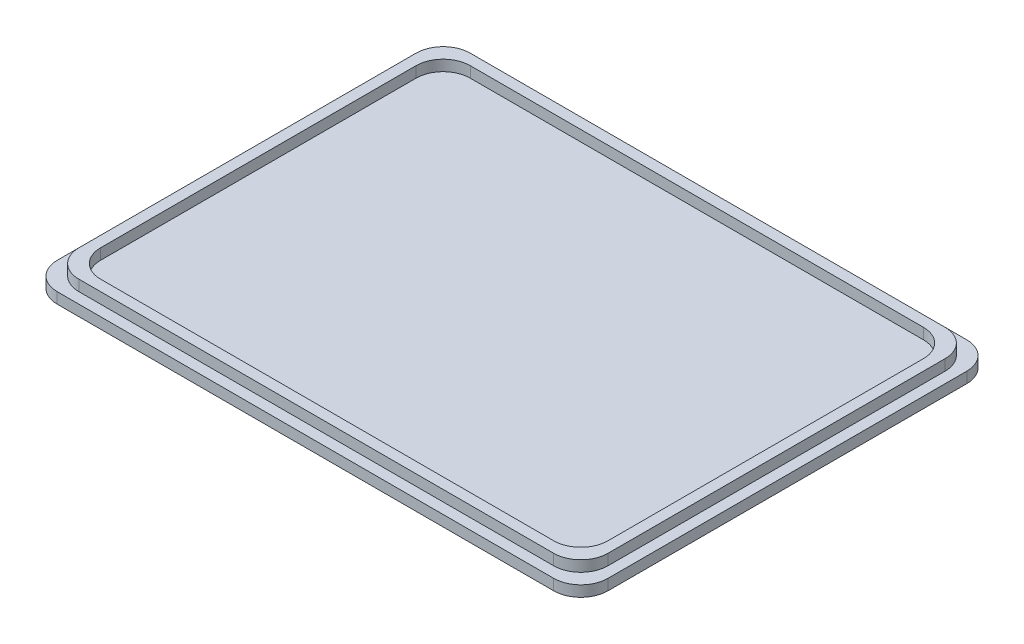
ISO-10303-21;
HEADER;
FILE_DESCRIPTION(('STEP AP214'),'2;1');
FILE_NAME('part.step','',(''),(''),'','','');
FILE_SCHEMA(('AUTOMOTIVE_DESIGN { 1 0 10303 214 1 1 1 1 }'));
ENDSEC;
DATA;
#1=APPLICATION_CONTEXT('core data for automotive mechanical design processes');
#2=APPLICATION_PROTOCOL_DEFINITION('international standard','automotive_design',2000,#1);
#3=PRODUCT_CONTEXT('',#1,'mechanical');
#4=PRODUCT('Part','Part','',(#3));
#5=PRODUCT_RELATED_PRODUCT_CATEGORY('part','',(#4));
#6=PRODUCT_DEFINITION_FORMATION('','',#4);
#7=PRODUCT_DEFINITION_CONTEXT('part definition',#1,'design');
#8=PRODUCT_DEFINITION('design','',#6,#7);
#9=PRODUCT_DEFINITION_SHAPE('','',#8);
#10=(LENGTH_UNIT() NAMED_UNIT(*) SI_UNIT(.MILLI.,.METRE.));
#11=(NAMED_UNIT(*) PLANE_ANGLE_UNIT() SI_UNIT($,.RADIAN.));
#12=(NAMED_UNIT(*) SI_UNIT($,.STERADIAN.) SOLID_ANGLE_UNIT());
#13=UNCERTAINTY_MEASURE_WITH_UNIT(LENGTH_MEASURE(1.E-05),#10,'distance_accuracy_value','');
#14=(GEOMETRIC_REPRESENTATION_CONTEXT(3) GLOBAL_UNCERTAINTY_ASSIGNED_CONTEXT((#13)) GLOBAL_UNIT_ASSIGNED_CONTEXT((#10,
#11,#12)) REPRESENTATION_CONTEXT('',''));
#15=CARTESIAN_POINT('',(0.,0.,0.));
#16=DIRECTION('',(0.,0.,1.));
#17=DIRECTION('',(1.,0.,0.));
#18=AXIS2_PLACEMENT_3D('',#15,#16,#17);
#19=CARTESIAN_POINT('',(0.,2.,0.));
#20=DIRECTION('',(0.,-1.,0.));
#21=DIRECTION('',(0.,0.,-1.));
#22=AXIS2_PLACEMENT_3D('',#19,#20,#21);
#23=PLANE('',#22);
#24=DIRECTION('',(-1.,0.,0.));
#25=VECTOR('',#24,1.);
#26=CARTESIAN_POINT('',(-50.8,2.,-38.1));
#27=LINE('',#26,#25);
#28=CARTESIAN_POINT('',(45.8,2.,-38.1));
#29=VERTEX_POINT('',#28);
#30=CARTESIAN_POINT('',(-45.8,2.,-38.1));
#31=VERTEX_POINT('',#30);
#32=EDGE_CURVE('E389',#29,#31,#27,.T.);
#33=ORIENTED_EDGE('',*,*,#32,.T.);
#34=CARTESIAN_POINT('',(-45.8,2.,-33.1));
#35=DIRECTION('',(0.,-1.,0.));
#36=DIRECTION('',(0.,0.,-1.));
#37=AXIS2_PLACEMENT_3D('',#34,#35,#36);
#38=CIRCLE('',#37,5.);
#39=CARTESIAN_POINT('',(-50.8,2.,-33.1));
#40=VERTEX_POINT('',#39);
#41=EDGE_CURVE('E267',#31,#40,#38,.F.);
#42=ORIENTED_EDGE('',*,*,#41,.T.);
#43=DIRECTION('',(0.,0.,1.));
#44=VECTOR('',#43,1.);
#45=CARTESIAN_POINT('',(-50.8,2.,38.1));
#46=LINE('',#45,#44);
#47=CARTESIAN_POINT('',(-50.8,2.,33.1));
#48=VERTEX_POINT('',#47);
#49=EDGE_CURVE('E236',#40,#48,#46,.T.);
#50=ORIENTED_EDGE('',*,*,#49,.T.);
#51=CARTESIAN_POINT('',(-45.8,2.,33.1));
#52=DIRECTION('',(0.,-1.,0.));
#53=DIRECTION('',(0.,0.,-1.));
#54=AXIS2_PLACEMENT_3D('',#51,#52,#53);
#55=CIRCLE('',#54,5.);
#56=CARTESIAN_POINT('',(-45.8,2.,38.1));
#57=VERTEX_POINT('',#56);
#58=EDGE_CURVE('E265',#48,#57,#55,.F.);
#59=ORIENTED_EDGE('',*,*,#58,.T.);
#60=DIRECTION('',(1.,0.,0.));
#61=VECTOR('',#60,1.);
#62=CARTESIAN_POINT('',(-50.8,2.,38.1));
#63=LINE('',#62,#61);
#64=CARTESIAN_POINT('',(45.8,2.,38.1));
#65=VERTEX_POINT('',#64);
#66=EDGE_CURVE('E252',#57,#65,#63,.T.);
#67=ORIENTED_EDGE('',*,*,#66,.T.);
#68=CARTESIAN_POINT('',(45.8,2.,33.1));
#69=DIRECTION('',(0.,-1.,0.));
#70=DIRECTION('',(0.,0.,-1.));
#71=AXIS2_PLACEMENT_3D('',#68,#69,#70);
#72=CIRCLE('',#71,5.);
#73=CARTESIAN_POINT('',(50.8,2.,33.1));
#74=VERTEX_POINT('',#73);
#75=EDGE_CURVE('E261',#65,#74,#72,.F.);
#76=ORIENTED_EDGE('',*,*,#75,.T.);
#77=DIRECTION('',(0.,0.,-1.));
#78=VECTOR('',#77,1.);
#79=CARTESIAN_POINT('',(50.8,2.,38.1));
#80=LINE('',#79,#78);
#81=CARTESIAN_POINT('',(50.8,2.,-33.1));
#82=VERTEX_POINT('',#81);
#83=EDGE_CURVE('E246',#74,#82,#80,.T.);
#84=ORIENTED_EDGE('',*,*,#83,.T.);
#85=CARTESIAN_POINT('',(45.8,2.,-33.1));
#86=DIRECTION('',(0.,-1.,0.));
#87=DIRECTION('',(0.,0.,-1.));
#88=AXIS2_PLACEMENT_3D('',#85,#86,#87);
#89=CIRCLE('',#88,5.);
#90=EDGE_CURVE('E263',#82,#29,#89,.F.);
#91=ORIENTED_EDGE('',*,*,#90,.T.);
#92=EDGE_LOOP('',(#33,#42,#50,#59,#67,#76,#84,#91));
#93=FACE_BOUND('',#92,.T.);
#94=DIRECTION('',(-1.,0.,0.));
#95=VECTOR('',#94,1.);
#96=CARTESIAN_POINT('',(48.8,2.,-36.1));
#97=LINE('',#96,#95);
#98=CARTESIAN_POINT('',(43.8,2.,-36.1));
#99=VERTEX_POINT('',#98);
#100=CARTESIAN_POINT('',(-43.8,2.,-36.1));
#101=VERTEX_POINT('',#100);
#102=EDGE_CURVE('E380',#99,#101,#97,.T.);
#103=ORIENTED_EDGE('',*,*,#102,.F.);
#104=CARTESIAN_POINT('',(43.8,2.,-31.1));
#105=DIRECTION('',(0.,-1.,0.));
#106=DIRECTION('',(0.,0.,-1.));
#107=AXIS2_PLACEMENT_3D('',#104,#105,#106);
#108=CIRCLE('',#107,5.);
#109=CARTESIAN_POINT('',(48.8,2.,-31.1));
#110=VERTEX_POINT('',#109);
#111=EDGE_CURVE('E342',#99,#110,#108,.T.);
#112=ORIENTED_EDGE('',*,*,#111,.T.);
#113=DIRECTION('',(0.,0.,-1.));
#114=VECTOR('',#113,1.);
#115=CARTESIAN_POINT('',(48.8,2.,36.1));
#116=LINE('',#115,#114);
#117=CARTESIAN_POINT('',(48.8,2.,31.1));
#118=VERTEX_POINT('',#117);
#119=EDGE_CURVE('E350',#118,#110,#116,.T.);
#120=ORIENTED_EDGE('',*,*,#119,.F.);
#121=CARTESIAN_POINT('',(43.8,2.,31.1));
#122=DIRECTION('',(0.,-1.,0.));
#123=DIRECTION('',(0.,0.,-1.));
#124=AXIS2_PLACEMENT_3D('',#121,#122,#123);
#125=CIRCLE('',#124,5.);
#126=CARTESIAN_POINT('',(43.8,2.,36.1));
#127=VERTEX_POINT('',#126);
#128=EDGE_CURVE('E344',#118,#127,#125,.T.);
#129=ORIENTED_EDGE('',*,*,#128,.T.);
#130=DIRECTION('',(1.,0.,0.));
#131=VECTOR('',#130,1.);
#132=CARTESIAN_POINT('',(-48.8,2.,36.1));
#133=LINE('',#132,#131);
#134=CARTESIAN_POINT('',(-43.8,2.,36.1));
#135=VERTEX_POINT('',#134);
#136=EDGE_CURVE('E348',#135,#127,#133,.T.);
#137=ORIENTED_EDGE('',*,*,#136,.F.);
#138=CARTESIAN_POINT('',(-43.8,2.,31.1));
#139=DIRECTION('',(0.,-1.,0.));
#140=DIRECTION('',(0.,0.,-1.));
#141=AXIS2_PLACEMENT_3D('',#138,#139,#140);
#142=CIRCLE('',#141,5.);
#143=CARTESIAN_POINT('',(-48.8,2.,31.1));
#144=VERTEX_POINT('',#143);
#145=EDGE_CURVE('E64',#135,#144,#142,.T.);
#146=ORIENTED_EDGE('',*,*,#145,.T.);
#147=DIRECTION('',(0.,0.,1.));
#148=VECTOR('',#147,1.);
#149=CARTESIAN_POINT('',(-48.8,2.,-36.1));
#150=LINE('',#149,#148);
#151=CARTESIAN_POINT('',(-48.8,2.,-31.1));
#152=VERTEX_POINT('',#151);
#153=EDGE_CURVE('E359',#152,#144,#150,.T.);
#154=ORIENTED_EDGE('',*,*,#153,.F.);
#155=CARTESIAN_POINT('',(-43.8,2.,-31.1));
#156=DIRECTION('',(0.,-1.,0.));
#157=DIRECTION('',(0.,0.,-1.));
#158=AXIS2_PLACEMENT_3D('',#155,#156,#157);
#159=CIRCLE('',#158,5.);
#160=EDGE_CURVE('E12',#152,#101,#159,.T.);
#161=ORIENTED_EDGE('',*,*,#160,.T.);
#162=EDGE_LOOP('',(#103,#112,#120,#129,#137,#146,#154,#161));
#163=FACE_BOUND('',#162,.T.);
#164=ADVANCED_FACE('F56',(#93,#163),#23,.F.);
#165=CARTESIAN_POINT('',(50.8,2.,38.1));
#166=DIRECTION('',(-1.,0.,0.));
#167=DIRECTION('',(0.,0.,1.));
#168=AXIS2_PLACEMENT_3D('',#165,#166,#167);
#169=PLANE('',#168);
#170=DIRECTION('',(0.,0.,-1.));
#171=VECTOR('',#170,1.);
#172=CARTESIAN_POINT('',(50.8,0.,38.1));
#173=LINE('',#172,#171);
#174=CARTESIAN_POINT('',(50.8,0.,33.1));
#175=VERTEX_POINT('',#174);
#176=CARTESIAN_POINT('',(50.8,0.,-33.1));
#177=VERTEX_POINT('',#176);
#178=EDGE_CURVE('E248',#175,#177,#173,.T.);
#179=ORIENTED_EDGE('',*,*,#178,.T.);
#180=DIRECTION('',(0.,-1.,0.));
#181=VECTOR('',#180,1.);
#182=CARTESIAN_POINT('',(50.8,2.,-33.1));
#183=LINE('',#182,#181);
#184=EDGE_CURVE('E277',#177,#82,#183,.F.);
#185=ORIENTED_EDGE('',*,*,#184,.T.);
#186=ORIENTED_EDGE('',*,*,#83,.F.);
#187=DIRECTION('',(0.,-1.,0.));
#188=VECTOR('',#187,1.);
#189=CARTESIAN_POINT('',(50.8,2.,33.1));
#190=LINE('',#189,#188);
#191=EDGE_CURVE('E274',#74,#175,#190,.T.);
#192=ORIENTED_EDGE('',*,*,#191,.T.);
#193=EDGE_LOOP('',(#179,#185,#186,#192));
#194=FACE_BOUND('',#193,.T.);
#195=ADVANCED_FACE('F407',(#194),#169,.F.);
#196=CARTESIAN_POINT('',(-50.8,2.,-38.1));
#197=DIRECTION('',(0.,0.,1.));
#198=DIRECTION('',(1.,0.,0.));
#199=AXIS2_PLACEMENT_3D('',#196,#197,#198);
#200=PLANE('',#199);
#201=DIRECTION('',(-1.,0.,0.));
#202=VECTOR('',#201,1.);
#203=CARTESIAN_POINT('',(-50.8,0.,-38.1));
#204=LINE('',#203,#202);
#205=CARTESIAN_POINT('',(45.8,0.,-38.1));
#206=VERTEX_POINT('',#205);
#207=CARTESIAN_POINT('',(-45.8,0.,-38.1));
#208=VERTEX_POINT('',#207);
#209=EDGE_CURVE('E243',#206,#208,#204,.T.);
#210=ORIENTED_EDGE('',*,*,#209,.T.);
#211=DIRECTION('',(0.,-1.,0.));
#212=VECTOR('',#211,1.);
#213=CARTESIAN_POINT('',(-45.8,2.,-38.1));
#214=LINE('',#213,#212);
#215=EDGE_CURVE('E221',#208,#31,#214,.F.);
#216=ORIENTED_EDGE('',*,*,#215,.T.);
#217=ORIENTED_EDGE('',*,*,#32,.F.);
#218=DIRECTION('',(0.,-1.,0.));
#219=VECTOR('',#218,1.);
#220=CARTESIAN_POINT('',(45.8,2.,-38.1));
#221=LINE('',#220,#219);
#222=EDGE_CURVE('E226',#29,#206,#221,.T.);
#223=ORIENTED_EDGE('',*,*,#222,.T.);
#224=EDGE_LOOP('',(#210,#216,#217,#223));
#225=FACE_BOUND('',#224,.T.);
#226=ADVANCED_FACE('F415',(#225),#200,.F.);
#227=CARTESIAN_POINT('',(-50.8,2.,38.1));
#228=DIRECTION('',(1.,0.,0.));
#229=DIRECTION('',(0.,0.,-1.));
#230=AXIS2_PLACEMENT_3D('',#227,#228,#229);
#231=PLANE('',#230);
#232=ORIENTED_EDGE('',*,*,#49,.F.);
#233=DIRECTION('',(0.,-1.,0.));
#234=VECTOR('',#233,1.);
#235=CARTESIAN_POINT('',(-50.8,2.,-33.1));
#236=LINE('',#235,#234);
#237=CARTESIAN_POINT('',(-50.8,0.,-33.1));
#238=VERTEX_POINT('',#237);
#239=EDGE_CURVE('E220',#40,#238,#236,.T.);
#240=ORIENTED_EDGE('',*,*,#239,.T.);
#241=DIRECTION('',(0.,0.,1.));
#242=VECTOR('',#241,1.);
#243=CARTESIAN_POINT('',(-50.8,0.,38.1));
#244=LINE('',#243,#242);
#245=CARTESIAN_POINT('',(-50.8,0.,33.1));
#246=VERTEX_POINT('',#245);
#247=EDGE_CURVE('E233',#238,#246,#244,.T.);
#248=ORIENTED_EDGE('',*,*,#247,.T.);
#249=DIRECTION('',(0.,-1.,0.));
#250=VECTOR('',#249,1.);
#251=CARTESIAN_POINT('',(-50.8,2.,33.1));
#252=LINE('',#251,#250);
#253=EDGE_CURVE('E238',#246,#48,#252,.F.);
#254=ORIENTED_EDGE('',*,*,#253,.T.);
#255=EDGE_LOOP('',(#232,#240,#248,#254));
#256=FACE_BOUND('',#255,.T.);
#257=ADVANCED_FACE('F232',(#256),#231,.F.);
#258=CARTESIAN_POINT('',(-50.8,2.,38.1));
#259=DIRECTION('',(0.,0.,-1.));
#260=DIRECTION('',(-1.,0.,0.));
#261=AXIS2_PLACEMENT_3D('',#258,#259,#260);
#262=PLANE('',#261);
#263=ORIENTED_EDGE('',*,*,#66,.F.);
#264=DIRECTION('',(0.,-1.,0.));
#265=VECTOR('',#264,1.);
#266=CARTESIAN_POINT('',(-45.8,2.,38.1));
#267=LINE('',#266,#265);
#268=CARTESIAN_POINT('',(-45.8,0.,38.1));
#269=VERTEX_POINT('',#268);
#270=EDGE_CURVE('E271',#57,#269,#267,.T.);
#271=ORIENTED_EDGE('',*,*,#270,.T.);
#272=DIRECTION('',(1.,0.,0.));
#273=VECTOR('',#272,1.);
#274=CARTESIAN_POINT('',(-50.8,0.,38.1));
#275=LINE('',#274,#273);
#276=CARTESIAN_POINT('',(45.8,0.,38.1));
#277=VERTEX_POINT('',#276);
#278=EDGE_CURVE('E242',#269,#277,#275,.T.);
#279=ORIENTED_EDGE('',*,*,#278,.T.);
#280=DIRECTION('',(0.,-1.,0.));
#281=VECTOR('',#280,1.);
#282=CARTESIAN_POINT('',(45.8,2.,38.1));
#283=LINE('',#282,#281);
#284=EDGE_CURVE('E269',#277,#65,#283,.F.);
#285=ORIENTED_EDGE('',*,*,#284,.T.);
#286=EDGE_LOOP('',(#263,#271,#279,#285));
#287=FACE_BOUND('',#286,.T.);
#288=ADVANCED_FACE('F418',(#287),#262,.F.);
#289=CARTESIAN_POINT('',(0.,0.,0.));
#290=DIRECTION('',(0.,-1.,0.));
#291=DIRECTION('',(0.,0.,-1.));
#292=AXIS2_PLACEMENT_3D('',#289,#290,#291);
#293=PLANE('',#292);
#294=ORIENTED_EDGE('',*,*,#247,.F.);
#295=CARTESIAN_POINT('',(-45.8,0.,-33.1));
#296=DIRECTION('',(0.,-1.,0.));
#297=DIRECTION('',(0.,0.,-1.));
#298=AXIS2_PLACEMENT_3D('',#295,#296,#297);
#299=CIRCLE('',#298,5.);
#300=EDGE_CURVE('E216',#238,#208,#299,.T.);
#301=ORIENTED_EDGE('',*,*,#300,.T.);
#302=ORIENTED_EDGE('',*,*,#209,.F.);
#303=CARTESIAN_POINT('',(45.8,0.,-33.1));
#304=DIRECTION('',(0.,-1.,0.));
#305=DIRECTION('',(0.,0.,-1.));
#306=AXIS2_PLACEMENT_3D('',#303,#304,#305);
#307=CIRCLE('',#306,5.);
#308=EDGE_CURVE('E255',#206,#177,#307,.T.);
#309=ORIENTED_EDGE('',*,*,#308,.T.);
#310=ORIENTED_EDGE('',*,*,#178,.F.);
#311=CARTESIAN_POINT('',(45.8,0.,33.1));
#312=DIRECTION('',(0.,-1.,0.));
#313=DIRECTION('',(0.,0.,-1.));
#314=AXIS2_PLACEMENT_3D('',#311,#312,#313);
#315=CIRCLE('',#314,5.);
#316=EDGE_CURVE('E237',#175,#277,#315,.T.);
#317=ORIENTED_EDGE('',*,*,#316,.T.);
#318=ORIENTED_EDGE('',*,*,#278,.F.);
#319=CARTESIAN_POINT('',(-45.8,0.,33.1));
#320=DIRECTION('',(0.,-1.,0.));
#321=DIRECTION('',(0.,0.,-1.));
#322=AXIS2_PLACEMENT_3D('',#319,#320,#321);
#323=CIRCLE('',#322,5.);
#324=EDGE_CURVE('E227',#269,#246,#323,.T.);
#325=ORIENTED_EDGE('',*,*,#324,.T.);
#326=EDGE_LOOP('',(#294,#301,#302,#309,#310,#317,#318,#325));
#327=FACE_BOUND('',#326,.T.);
#328=ADVANCED_FACE('F240',(#327),#293,.T.);
#329=CARTESIAN_POINT('',(0.,4.,0.));
#330=DIRECTION('',(0.,1.,0.));
#331=DIRECTION('',(0.,0.,1.));
#332=AXIS2_PLACEMENT_3D('',#329,#330,#331);
#333=PLANE('',#332);
#334=DIRECTION('',(0.,0.,-1.));
#335=VECTOR('',#334,1.);
#336=CARTESIAN_POINT('',(48.8,4.,36.1));
#337=LINE('',#336,#335);
#338=CARTESIAN_POINT('',(48.8,4.,31.1));
#339=VERTEX_POINT('',#338);
#340=CARTESIAN_POINT('',(48.8,4.,-31.1));
#341=VERTEX_POINT('',#340);
#342=EDGE_CURVE('E368',#339,#341,#337,.T.);
#343=ORIENTED_EDGE('',*,*,#342,.T.);
#344=CARTESIAN_POINT('',(43.8,4.,-31.1));
#345=DIRECTION('',(0.,1.,0.));
#346=DIRECTION('',(0.,0.,1.));
#347=AXIS2_PLACEMENT_3D('',#344,#345,#346);
#348=CIRCLE('',#347,5.);
#349=CARTESIAN_POINT('',(43.8,4.,-36.1));
#350=VERTEX_POINT('',#349);
#351=EDGE_CURVE('E323',#341,#350,#348,.T.);
#352=ORIENTED_EDGE('',*,*,#351,.T.);
#353=DIRECTION('',(-1.,0.,0.));
#354=VECTOR('',#353,1.);
#355=CARTESIAN_POINT('',(48.8,4.,-36.1));
#356=LINE('',#355,#354);
#357=CARTESIAN_POINT('',(-43.8,4.,-36.1));
#358=VERTEX_POINT('',#357);
#359=EDGE_CURVE('E386',#350,#358,#356,.T.);
#360=ORIENTED_EDGE('',*,*,#359,.T.);
#361=CARTESIAN_POINT('',(-43.8,4.,-31.1));
#362=DIRECTION('',(0.,1.,0.));
#363=DIRECTION('',(0.,0.,1.));
#364=AXIS2_PLACEMENT_3D('',#361,#362,#363);
#365=CIRCLE('',#364,5.);
#366=CARTESIAN_POINT('',(-48.8,4.,-31.1));
#367=VERTEX_POINT('',#366);
#368=EDGE_CURVE('E317',#358,#367,#365,.T.);
#369=ORIENTED_EDGE('',*,*,#368,.T.);
#370=DIRECTION('',(0.,0.,1.));
#371=VECTOR('',#370,1.);
#372=CARTESIAN_POINT('',(-48.8,4.,-36.1));
#373=LINE('',#372,#371);
#374=CARTESIAN_POINT('',(-48.8,4.,31.1));
#375=VERTEX_POINT('',#374);
#376=EDGE_CURVE('E376',#367,#375,#373,.T.);
#377=ORIENTED_EDGE('',*,*,#376,.T.);
#378=CARTESIAN_POINT('',(-43.8,4.,31.1));
#379=DIRECTION('',(0.,1.,0.));
#380=DIRECTION('',(0.,0.,1.));
#381=AXIS2_PLACEMENT_3D('',#378,#379,#380);
#382=CIRCLE('',#381,5.);
#383=CARTESIAN_POINT('',(-43.8,4.,36.1));
#384=VERTEX_POINT('',#383);
#385=EDGE_CURVE('E319',#375,#384,#382,.T.);
#386=ORIENTED_EDGE('',*,*,#385,.T.);
#387=DIRECTION('',(1.,0.,0.));
#388=VECTOR('',#387,1.);
#389=CARTESIAN_POINT('',(-48.8,4.,36.1));
#390=LINE('',#389,#388);
#391=CARTESIAN_POINT('',(43.8,4.,36.1));
#392=VERTEX_POINT('',#391);
#393=EDGE_CURVE('E370',#384,#392,#390,.T.);
#394=ORIENTED_EDGE('',*,*,#393,.T.);
#395=CARTESIAN_POINT('',(43.8,4.,31.1));
#396=DIRECTION('',(0.,1.,0.));
#397=DIRECTION('',(0.,0.,1.));
#398=AXIS2_PLACEMENT_3D('',#395,#396,#397);
#399=CIRCLE('',#398,5.);
#400=EDGE_CURVE('E321',#392,#339,#399,.T.);
#401=ORIENTED_EDGE('',*,*,#400,.T.);
#402=EDGE_LOOP('',(#343,#352,#360,#369,#377,#386,#394,#401));
#403=FACE_BOUND('',#402,.T.);
#404=DIRECTION('',(0.,0.,1.));
#405=VECTOR('',#404,1.);
#406=CARTESIAN_POINT('',(-46.8,4.,-36.1));
#407=LINE('',#406,#405);
#408=CARTESIAN_POINT('',(-46.8,4.,-29.1));
#409=VERTEX_POINT('',#408);
#410=CARTESIAN_POINT('',(-46.8,4.,29.1));
#411=VERTEX_POINT('',#410);
#412=EDGE_CURVE('E457',#409,#411,#407,.T.);
#413=ORIENTED_EDGE('',*,*,#412,.F.);
#414=CARTESIAN_POINT('',(-41.8,4.,-29.1));
#415=DIRECTION('',(0.,1.,0.));
#416=DIRECTION('',(0.,0.,1.));
#417=AXIS2_PLACEMENT_3D('',#414,#415,#416);
#418=CIRCLE('',#417,5.);
#419=CARTESIAN_POINT('',(-41.8,4.,-34.1));
#420=VERTEX_POINT('',#419);
#421=EDGE_CURVE('E340',#409,#420,#418,.F.);
#422=ORIENTED_EDGE('',*,*,#421,.T.);
#423=DIRECTION('',(-1.,0.,0.));
#424=VECTOR('',#423,1.);
#425=CARTESIAN_POINT('',(48.8,4.,-34.1));
#426=LINE('',#425,#424);
#427=CARTESIAN_POINT('',(41.8,4.,-34.1));
#428=VERTEX_POINT('',#427);
#429=EDGE_CURVE('E453',#428,#420,#426,.T.);
#430=ORIENTED_EDGE('',*,*,#429,.F.);
#431=CARTESIAN_POINT('',(41.8,4.,-29.1));
#432=DIRECTION('',(0.,1.,0.));
#433=DIRECTION('',(0.,0.,1.));
#434=AXIS2_PLACEMENT_3D('',#431,#432,#433);
#435=CIRCLE('',#434,5.);
#436=CARTESIAN_POINT('',(46.8,4.,-29.1));
#437=VERTEX_POINT('',#436);
#438=EDGE_CURVE('E334',#428,#437,#435,.F.);
#439=ORIENTED_EDGE('',*,*,#438,.T.);
#440=DIRECTION('',(0.,0.,-1.));
#441=VECTOR('',#440,1.);
#442=CARTESIAN_POINT('',(46.8,4.,36.1));
#443=LINE('',#442,#441);
#444=CARTESIAN_POINT('',(46.8,4.,29.1));
#445=VERTEX_POINT('',#444);
#446=EDGE_CURVE('E383',#445,#437,#443,.T.);
#447=ORIENTED_EDGE('',*,*,#446,.F.);
#448=CARTESIAN_POINT('',(41.8,4.,29.1));
#449=DIRECTION('',(0.,1.,0.));
#450=DIRECTION('',(0.,0.,1.));
#451=AXIS2_PLACEMENT_3D('',#448,#449,#450);
#452=CIRCLE('',#451,5.);
#453=CARTESIAN_POINT('',(41.8,4.,34.1));
#454=VERTEX_POINT('',#453);
#455=EDGE_CURVE('E336',#445,#454,#452,.F.);
#456=ORIENTED_EDGE('',*,*,#455,.T.);
#457=DIRECTION('',(1.,0.,0.));
#458=VECTOR('',#457,1.);
#459=CARTESIAN_POINT('',(-48.8,4.,34.1));
#460=LINE('',#459,#458);
#461=CARTESIAN_POINT('',(-41.8,4.,34.1));
#462=VERTEX_POINT('',#461);
#463=EDGE_CURVE('E687',#462,#454,#460,.T.);
#464=ORIENTED_EDGE('',*,*,#463,.F.);
#465=CARTESIAN_POINT('',(-41.8,4.,29.1));
#466=DIRECTION('',(0.,1.,0.));
#467=DIRECTION('',(0.,0.,1.));
#468=AXIS2_PLACEMENT_3D('',#465,#466,#467);
#469=CIRCLE('',#468,5.);
#470=EDGE_CURVE('E338',#462,#411,#469,.F.);
#471=ORIENTED_EDGE('',*,*,#470,.T.);
#472=EDGE_LOOP('',(#413,#422,#430,#439,#447,#456,#464,#471));
#473=FACE_BOUND('',#472,.T.);
#474=ADVANCED_FACE('F366',(#403,#473),#333,.T.);
#475=CARTESIAN_POINT('',(48.8,4.,-36.1));
#476=DIRECTION('',(0.,0.,1.));
#477=DIRECTION('',(1.,0.,0.));
#478=AXIS2_PLACEMENT_3D('',#475,#476,#477);
#479=PLANE('',#478);
#480=ORIENTED_EDGE('',*,*,#359,.F.);
#481=DIRECTION('',(0.,-1.,0.));
#482=VECTOR('',#481,1.);
#483=CARTESIAN_POINT('',(43.8,4.,-36.1));
#484=LINE('',#483,#482);
#485=EDGE_CURVE('E309',#350,#99,#484,.T.);
#486=ORIENTED_EDGE('',*,*,#485,.T.);
#487=ORIENTED_EDGE('',*,*,#102,.T.);
#488=DIRECTION('',(0.,-1.,0.));
#489=VECTOR('',#488,1.);
#490=CARTESIAN_POINT('',(-43.8,4.,-36.1));
#491=LINE('',#490,#489);
#492=EDGE_CURVE('E307',#101,#358,#491,.F.);
#493=ORIENTED_EDGE('',*,*,#492,.T.);
#494=EDGE_LOOP('',(#480,#486,#487,#493));
#495=FACE_BOUND('',#494,.T.);
#496=ADVANCED_FACE('F475',(#495),#479,.F.);
#497=CARTESIAN_POINT('',(-48.8,4.,-36.1));
#498=DIRECTION('',(1.,0.,0.));
#499=DIRECTION('',(0.,0.,-1.));
#500=AXIS2_PLACEMENT_3D('',#497,#498,#499);
#501=PLANE('',#500);
#502=ORIENTED_EDGE('',*,*,#153,.T.);
#503=DIRECTION('',(0.,-1.,0.));
#504=VECTOR('',#503,1.);
#505=CARTESIAN_POINT('',(-48.8,4.,31.1));
#506=LINE('',#505,#504);
#507=EDGE_CURVE('E332',#144,#375,#506,.F.);
#508=ORIENTED_EDGE('',*,*,#507,.T.);
#509=ORIENTED_EDGE('',*,*,#376,.F.);
#510=DIRECTION('',(0.,-1.,0.));
#511=VECTOR('',#510,1.);
#512=CARTESIAN_POINT('',(-48.8,4.,-31.1));
#513=LINE('',#512,#511);
#514=EDGE_CURVE('E330',#367,#152,#513,.T.);
#515=ORIENTED_EDGE('',*,*,#514,.T.);
#516=EDGE_LOOP('',(#502,#508,#509,#515));
#517=FACE_BOUND('',#516,.T.);
#518=ADVANCED_FACE('F472',(#517),#501,.F.);
#519=CARTESIAN_POINT('',(-48.8,4.,36.1));
#520=DIRECTION('',(0.,0.,-1.));
#521=DIRECTION('',(-1.,0.,0.));
#522=AXIS2_PLACEMENT_3D('',#519,#520,#521);
#523=PLANE('',#522);
#524=ORIENTED_EDGE('',*,*,#136,.T.);
#525=DIRECTION('',(0.,-1.,0.));
#526=VECTOR('',#525,1.);
#527=CARTESIAN_POINT('',(43.8,4.,36.1));
#528=LINE('',#527,#526);
#529=EDGE_CURVE('E328',#127,#392,#528,.F.);
#530=ORIENTED_EDGE('',*,*,#529,.T.);
#531=ORIENTED_EDGE('',*,*,#393,.F.);
#532=DIRECTION('',(0.,-1.,0.));
#533=VECTOR('',#532,1.);
#534=CARTESIAN_POINT('',(-43.8,4.,36.1));
#535=LINE('',#534,#533);
#536=EDGE_CURVE('E325',#384,#135,#535,.T.);
#537=ORIENTED_EDGE('',*,*,#536,.T.);
#538=EDGE_LOOP('',(#524,#530,#531,#537));
#539=FACE_BOUND('',#538,.T.);
#540=ADVANCED_FACE('F355',(#539),#523,.F.);
#541=CARTESIAN_POINT('',(48.8,4.,36.1));
#542=DIRECTION('',(-1.,0.,0.));
#543=DIRECTION('',(0.,0.,1.));
#544=AXIS2_PLACEMENT_3D('',#541,#542,#543);
#545=PLANE('',#544);
#546=ORIENTED_EDGE('',*,*,#119,.T.);
#547=DIRECTION('',(0.,-1.,0.));
#548=VECTOR('',#547,1.);
#549=CARTESIAN_POINT('',(48.8,4.,-31.1));
#550=LINE('',#549,#548);
#551=EDGE_CURVE('E315',#110,#341,#550,.F.);
#552=ORIENTED_EDGE('',*,*,#551,.T.);
#553=ORIENTED_EDGE('',*,*,#342,.F.);
#554=DIRECTION('',(0.,-1.,0.));
#555=VECTOR('',#554,1.);
#556=CARTESIAN_POINT('',(48.8,4.,31.1));
#557=LINE('',#556,#555);
#558=EDGE_CURVE('E312',#339,#118,#557,.T.);
#559=ORIENTED_EDGE('',*,*,#558,.T.);
#560=EDGE_LOOP('',(#546,#552,#553,#559));
#561=FACE_BOUND('',#560,.T.);
#562=ADVANCED_FACE('F372',(#561),#545,.F.);
#563=CARTESIAN_POINT('',(48.8,4.,-34.1));
#564=DIRECTION('',(0.,0.,1.));
#565=DIRECTION('',(1.,0.,0.));
#566=AXIS2_PLACEMENT_3D('',#563,#564,#565);
#567=PLANE('',#566);
#568=DIRECTION('',(-1.,0.,0.));
#569=VECTOR('',#568,1.);
#570=CARTESIAN_POINT('',(48.8,2.,-34.1));
#571=LINE('',#570,#569);
#572=CARTESIAN_POINT('',(41.8,2.,-34.1));
#573=VERTEX_POINT('',#572);
#574=CARTESIAN_POINT('',(-41.8,2.,-34.1));
#575=VERTEX_POINT('',#574);
#576=EDGE_CURVE('E703',#573,#575,#571,.T.);
#577=ORIENTED_EDGE('',*,*,#576,.F.);
#578=DIRECTION('',(0.,-1.,0.));
#579=VECTOR('',#578,1.);
#580=CARTESIAN_POINT('',(41.8,4.,-34.1));
#581=LINE('',#580,#579);
#582=EDGE_CURVE('E295',#573,#428,#581,.F.);
#583=ORIENTED_EDGE('',*,*,#582,.T.);
#584=ORIENTED_EDGE('',*,*,#429,.T.);
#585=DIRECTION('',(0.,-1.,0.));
#586=VECTOR('',#585,1.);
#587=CARTESIAN_POINT('',(-41.8,2.,-34.1));
#588=LINE('',#587,#586);
#589=EDGE_CURVE('E292',#420,#575,#588,.T.);
#590=ORIENTED_EDGE('',*,*,#589,.T.);
#591=EDGE_LOOP('',(#577,#583,#584,#590));
#592=FACE_BOUND('',#591,.T.);
#593=ADVANCED_FACE('F602',(#592),#567,.T.);
#594=CARTESIAN_POINT('',(-46.8,4.,-36.1));
#595=DIRECTION('',(1.,0.,0.));
#596=DIRECTION('',(0.,0.,-1.));
#597=AXIS2_PLACEMENT_3D('',#594,#595,#596);
#598=PLANE('',#597);
#599=ORIENTED_EDGE('',*,*,#412,.T.);
#600=DIRECTION('',(0.,-1.,0.));
#601=VECTOR('',#600,1.);
#602=CARTESIAN_POINT('',(-46.8,2.,29.1));
#603=LINE('',#602,#601);
#604=CARTESIAN_POINT('',(-46.8,2.,29.1));
#605=VERTEX_POINT('',#604);
#606=EDGE_CURVE('E304',#411,#605,#603,.T.);
#607=ORIENTED_EDGE('',*,*,#606,.T.);
#608=DIRECTION('',(0.,0.,1.));
#609=VECTOR('',#608,1.);
#610=CARTESIAN_POINT('',(-46.8,2.,-36.1));
#611=LINE('',#610,#609);
#612=CARTESIAN_POINT('',(-46.8,2.,-29.1));
#613=VERTEX_POINT('',#612);
#614=EDGE_CURVE('E459',#613,#605,#611,.T.);
#615=ORIENTED_EDGE('',*,*,#614,.F.);
#616=DIRECTION('',(0.,-1.,0.));
#617=VECTOR('',#616,1.);
#618=CARTESIAN_POINT('',(-46.8,4.,-29.1));
#619=LINE('',#618,#617);
#620=EDGE_CURVE('E302',#613,#409,#619,.F.);
#621=ORIENTED_EDGE('',*,*,#620,.T.);
#622=EDGE_LOOP('',(#599,#607,#615,#621));
#623=FACE_BOUND('',#622,.T.);
#624=ADVANCED_FACE('F611',(#623),#598,.T.);
#625=CARTESIAN_POINT('',(-48.8,4.,34.1));
#626=DIRECTION('',(0.,0.,-1.));
#627=DIRECTION('',(-1.,0.,0.));
#628=AXIS2_PLACEMENT_3D('',#625,#626,#627);
#629=PLANE('',#628);
#630=ORIENTED_EDGE('',*,*,#463,.T.);
#631=DIRECTION('',(0.,-1.,0.));
#632=VECTOR('',#631,1.);
#633=CARTESIAN_POINT('',(41.8,2.,34.1));
#634=LINE('',#633,#632);
#635=CARTESIAN_POINT('',(41.8,2.,34.1));
#636=VERTEX_POINT('',#635);
#637=EDGE_CURVE('E299',#454,#636,#634,.T.);
#638=ORIENTED_EDGE('',*,*,#637,.T.);
#639=DIRECTION('',(1.,0.,0.));
#640=VECTOR('',#639,1.);
#641=CARTESIAN_POINT('',(-48.8,2.,34.1));
#642=LINE('',#641,#640);
#643=CARTESIAN_POINT('',(-41.8,2.,34.1));
#644=VERTEX_POINT('',#643);
#645=EDGE_CURVE('E454',#644,#636,#642,.T.);
#646=ORIENTED_EDGE('',*,*,#645,.F.);
#647=DIRECTION('',(0.,-1.,0.));
#648=VECTOR('',#647,1.);
#649=CARTESIAN_POINT('',(-41.8,4.,34.1));
#650=LINE('',#649,#648);
#651=EDGE_CURVE('E297',#644,#462,#650,.F.);
#652=ORIENTED_EDGE('',*,*,#651,.T.);
#653=EDGE_LOOP('',(#630,#638,#646,#652));
#654=FACE_BOUND('',#653,.T.);
#655=ADVANCED_FACE('F443',(#654),#629,.T.);
#656=CARTESIAN_POINT('',(46.8,4.,36.1));
#657=DIRECTION('',(-1.,0.,0.));
#658=DIRECTION('',(0.,0.,1.));
#659=AXIS2_PLACEMENT_3D('',#656,#657,#658);
#660=PLANE('',#659);
#661=ORIENTED_EDGE('',*,*,#446,.T.);
#662=DIRECTION('',(0.,-1.,0.));
#663=VECTOR('',#662,1.);
#664=CARTESIAN_POINT('',(46.8,2.,-29.1));
#665=LINE('',#664,#663);
#666=CARTESIAN_POINT('',(46.8,2.,-29.1));
#667=VERTEX_POINT('',#666);
#668=EDGE_CURVE('E281',#437,#667,#665,.T.);
#669=ORIENTED_EDGE('',*,*,#668,.T.);
#670=DIRECTION('',(0.,0.,-1.));
#671=VECTOR('',#670,1.);
#672=CARTESIAN_POINT('',(46.8,2.,36.1));
#673=LINE('',#672,#671);
#674=CARTESIAN_POINT('',(46.8,2.,29.1));
#675=VERTEX_POINT('',#674);
#676=EDGE_CURVE('E448',#675,#667,#673,.T.);
#677=ORIENTED_EDGE('',*,*,#676,.F.);
#678=DIRECTION('',(0.,-1.,0.));
#679=VECTOR('',#678,1.);
#680=CARTESIAN_POINT('',(46.8,4.,29.1));
#681=LINE('',#680,#679);
#682=EDGE_CURVE('E279',#675,#445,#681,.F.);
#683=ORIENTED_EDGE('',*,*,#682,.T.);
#684=EDGE_LOOP('',(#661,#669,#677,#683));
#685=FACE_BOUND('',#684,.T.);
#686=ADVANCED_FACE('F436',(#685),#660,.T.);
#687=ORIENTED_EDGE('',*,*,#676,.T.);
#688=CARTESIAN_POINT('',(41.8,2.,-29.1));
#689=DIRECTION('',(0.,-1.,0.));
#690=DIRECTION('',(0.,0.,-1.));
#691=AXIS2_PLACEMENT_3D('',#688,#689,#690);
#692=CIRCLE('',#691,5.);
#693=EDGE_CURVE('E290',#667,#573,#692,.F.);
#694=ORIENTED_EDGE('',*,*,#693,.T.);
#695=ORIENTED_EDGE('',*,*,#576,.T.);
#696=CARTESIAN_POINT('',(-41.8,2.,-29.1));
#697=DIRECTION('',(0.,-1.,0.));
#698=DIRECTION('',(0.,0.,-1.));
#699=AXIS2_PLACEMENT_3D('',#696,#697,#698);
#700=CIRCLE('',#699,5.);
#701=EDGE_CURVE('E284',#575,#613,#700,.F.);
#702=ORIENTED_EDGE('',*,*,#701,.T.);
#703=ORIENTED_EDGE('',*,*,#614,.T.);
#704=CARTESIAN_POINT('',(-41.8,2.,29.1));
#705=DIRECTION('',(0.,-1.,0.));
#706=DIRECTION('',(0.,0.,-1.));
#707=AXIS2_PLACEMENT_3D('',#704,#705,#706);
#708=CIRCLE('',#707,5.);
#709=EDGE_CURVE('E286',#605,#644,#708,.F.);
#710=ORIENTED_EDGE('',*,*,#709,.T.);
#711=ORIENTED_EDGE('',*,*,#645,.T.);
#712=CARTESIAN_POINT('',(41.8,2.,29.1));
#713=DIRECTION('',(0.,-1.,0.));
#714=DIRECTION('',(0.,0.,-1.));
#715=AXIS2_PLACEMENT_3D('',#712,#713,#714);
#716=CIRCLE('',#715,5.);
#717=EDGE_CURVE('E288',#636,#675,#716,.F.);
#718=ORIENTED_EDGE('',*,*,#717,.T.);
#719=EDGE_LOOP('',(#687,#694,#695,#702,#703,#710,#711,#718));
#720=FACE_BOUND('',#719,.T.);
#721=ADVANCED_FACE('F429',(#720),#23,.F.);
#722=CARTESIAN_POINT('',(-45.8,2.,-33.1));
#723=DIRECTION('',(0.,-1.,0.));
#724=DIRECTION('',(0.,0.,-1.));
#725=AXIS2_PLACEMENT_3D('',#722,#723,#724);
#726=CYLINDRICAL_SURFACE('',#725,5.);
#727=ORIENTED_EDGE('',*,*,#41,.F.);
#728=ORIENTED_EDGE('',*,*,#215,.F.);
#729=ORIENTED_EDGE('',*,*,#300,.F.);
#730=ORIENTED_EDGE('',*,*,#239,.F.);
#731=EDGE_LOOP('',(#727,#728,#729,#730));
#732=FACE_BOUND('',#731,.T.);
#733=ADVANCED_FACE('F219',(#732),#726,.T.);
#734=CARTESIAN_POINT('',(-45.8,2.,33.1));
#735=DIRECTION('',(0.,-1.,0.));
#736=DIRECTION('',(0.,0.,-1.));
#737=AXIS2_PLACEMENT_3D('',#734,#735,#736);
#738=CYLINDRICAL_SURFACE('',#737,5.);
#739=ORIENTED_EDGE('',*,*,#58,.F.);
#740=ORIENTED_EDGE('',*,*,#253,.F.);
#741=ORIENTED_EDGE('',*,*,#324,.F.);
#742=ORIENTED_EDGE('',*,*,#270,.F.);
#743=EDGE_LOOP('',(#739,#740,#741,#742));
#744=FACE_BOUND('',#743,.T.);
#745=ADVANCED_FACE('F417',(#744),#738,.T.);
#746=CARTESIAN_POINT('',(45.8,2.,-33.1));
#747=DIRECTION('',(0.,-1.,0.));
#748=DIRECTION('',(0.,0.,-1.));
#749=AXIS2_PLACEMENT_3D('',#746,#747,#748);
#750=CYLINDRICAL_SURFACE('',#749,5.);
#751=ORIENTED_EDGE('',*,*,#90,.F.);
#752=ORIENTED_EDGE('',*,*,#184,.F.);
#753=ORIENTED_EDGE('',*,*,#308,.F.);
#754=ORIENTED_EDGE('',*,*,#222,.F.);
#755=EDGE_LOOP('',(#751,#752,#753,#754));
#756=FACE_BOUND('',#755,.T.);
#757=ADVANCED_FACE('F412',(#756),#750,.T.);
#758=CARTESIAN_POINT('',(45.8,2.,33.1));
#759=DIRECTION('',(0.,-1.,0.));
#760=DIRECTION('',(0.,0.,-1.));
#761=AXIS2_PLACEMENT_3D('',#758,#759,#760);
#762=CYLINDRICAL_SURFACE('',#761,5.);
#763=ORIENTED_EDGE('',*,*,#75,.F.);
#764=ORIENTED_EDGE('',*,*,#284,.F.);
#765=ORIENTED_EDGE('',*,*,#316,.F.);
#766=ORIENTED_EDGE('',*,*,#191,.F.);
#767=EDGE_LOOP('',(#763,#764,#765,#766));
#768=FACE_BOUND('',#767,.T.);
#769=ADVANCED_FACE('F404',(#768),#762,.T.);
#770=CARTESIAN_POINT('',(41.8,4.,-29.1));
#771=DIRECTION('',(0.,1.,0.));
#772=DIRECTION('',(0.,0.,1.));
#773=AXIS2_PLACEMENT_3D('',#770,#771,#772);
#774=CYLINDRICAL_SURFACE('',#773,5.);
#775=ORIENTED_EDGE('',*,*,#438,.F.);
#776=ORIENTED_EDGE('',*,*,#582,.F.);
#777=ORIENTED_EDGE('',*,*,#693,.F.);
#778=ORIENTED_EDGE('',*,*,#668,.F.);
#779=EDGE_LOOP('',(#775,#776,#777,#778));
#780=FACE_BOUND('',#779,.T.);
#781=ADVANCED_FACE('F501',(#780),#774,.F.);
#782=CARTESIAN_POINT('',(41.8,4.,29.1));
#783=DIRECTION('',(0.,1.,0.));
#784=DIRECTION('',(0.,0.,1.));
#785=AXIS2_PLACEMENT_3D('',#782,#783,#784);
#786=CYLINDRICAL_SURFACE('',#785,5.);
#787=ORIENTED_EDGE('',*,*,#455,.F.);
#788=ORIENTED_EDGE('',*,*,#682,.F.);
#789=ORIENTED_EDGE('',*,*,#717,.F.);
#790=ORIENTED_EDGE('',*,*,#637,.F.);
#791=EDGE_LOOP('',(#787,#788,#789,#790));
#792=FACE_BOUND('',#791,.T.);
#793=ADVANCED_FACE('F497',(#792),#786,.F.);
#794=CARTESIAN_POINT('',(-41.8,4.,29.1));
#795=DIRECTION('',(0.,1.,0.));
#796=DIRECTION('',(0.,0.,1.));
#797=AXIS2_PLACEMENT_3D('',#794,#795,#796);
#798=CYLINDRICAL_SURFACE('',#797,5.);
#799=ORIENTED_EDGE('',*,*,#470,.F.);
#800=ORIENTED_EDGE('',*,*,#651,.F.);
#801=ORIENTED_EDGE('',*,*,#709,.F.);
#802=ORIENTED_EDGE('',*,*,#606,.F.);
#803=EDGE_LOOP('',(#799,#800,#801,#802));
#804=FACE_BOUND('',#803,.T.);
#805=ADVANCED_FACE('F493',(#804),#798,.F.);
#806=CARTESIAN_POINT('',(-41.8,4.,-29.1));
#807=DIRECTION('',(0.,1.,0.));
#808=DIRECTION('',(0.,0.,1.));
#809=AXIS2_PLACEMENT_3D('',#806,#807,#808);
#810=CYLINDRICAL_SURFACE('',#809,5.);
#811=ORIENTED_EDGE('',*,*,#421,.F.);
#812=ORIENTED_EDGE('',*,*,#620,.F.);
#813=ORIENTED_EDGE('',*,*,#701,.F.);
#814=ORIENTED_EDGE('',*,*,#589,.F.);
#815=EDGE_LOOP('',(#811,#812,#813,#814));
#816=FACE_BOUND('',#815,.T.);
#817=ADVANCED_FACE('F489',(#816),#810,.F.);
#818=CARTESIAN_POINT('',(43.8,4.,-31.1));
#819=DIRECTION('',(0.,-1.,0.));
#820=DIRECTION('',(0.,0.,-1.));
#821=AXIS2_PLACEMENT_3D('',#818,#819,#820);
#822=CYLINDRICAL_SURFACE('',#821,5.);
#823=ORIENTED_EDGE('',*,*,#351,.F.);
#824=ORIENTED_EDGE('',*,*,#551,.F.);
#825=ORIENTED_EDGE('',*,*,#111,.F.);
#826=ORIENTED_EDGE('',*,*,#485,.F.);
#827=EDGE_LOOP('',(#823,#824,#825,#826));
#828=FACE_BOUND('',#827,.T.);
#829=ADVANCED_FACE('F484',(#828),#822,.T.);
#830=CARTESIAN_POINT('',(43.8,4.,31.1));
#831=DIRECTION('',(0.,-1.,0.));
#832=DIRECTION('',(0.,0.,-1.));
#833=AXIS2_PLACEMENT_3D('',#830,#831,#832);
#834=CYLINDRICAL_SURFACE('',#833,5.);
#835=ORIENTED_EDGE('',*,*,#400,.F.);
#836=ORIENTED_EDGE('',*,*,#529,.F.);
#837=ORIENTED_EDGE('',*,*,#128,.F.);
#838=ORIENTED_EDGE('',*,*,#558,.F.);
#839=EDGE_LOOP('',(#835,#836,#837,#838));
#840=FACE_BOUND('',#839,.T.);
#841=ADVANCED_FACE('F362',(#840),#834,.T.);
#842=CARTESIAN_POINT('',(-43.8,4.,31.1));
#843=DIRECTION('',(0.,-1.,0.));
#844=DIRECTION('',(0.,0.,-1.));
#845=AXIS2_PLACEMENT_3D('',#842,#843,#844);
#846=CYLINDRICAL_SURFACE('',#845,5.);
#847=ORIENTED_EDGE('',*,*,#385,.F.);
#848=ORIENTED_EDGE('',*,*,#507,.F.);
#849=ORIENTED_EDGE('',*,*,#145,.F.);
#850=ORIENTED_EDGE('',*,*,#536,.F.);
#851=EDGE_LOOP('',(#847,#848,#849,#850));
#852=FACE_BOUND('',#851,.T.);
#853=ADVANCED_FACE('F471',(#852),#846,.T.);
#854=CARTESIAN_POINT('',(-43.8,4.,-31.1));
#855=DIRECTION('',(0.,-1.,0.));
#856=DIRECTION('',(0.,0.,-1.));
#857=AXIS2_PLACEMENT_3D('',#854,#855,#856);
#858=CYLINDRICAL_SURFACE('',#857,5.);
#859=ORIENTED_EDGE('',*,*,#368,.F.);
#860=ORIENTED_EDGE('',*,*,#492,.F.);
#861=ORIENTED_EDGE('',*,*,#160,.F.);
#862=ORIENTED_EDGE('',*,*,#514,.F.);
#863=EDGE_LOOP('',(#859,#860,#861,#862));
#864=FACE_BOUND('',#863,.T.);
#865=ADVANCED_FACE('F58',(#864),#858,.T.);
#866=CLOSED_SHELL('',(#164,#195,#226,#257,#288,#328,#474,#496,#518,#540,#562,#593,#624,#655,
#686,#721,#733,#745,#757,#769,#781,#793,#805,#817,#829,#841,#853,#865));
#867=MANIFOLD_SOLID_BREP('B2',#866);
#868=ADVANCED_BREP_SHAPE_REPRESENTATION('',(#18,#867),#14);
#869=SHAPE_DEFINITION_REPRESENTATION(#9,#868);
ENDSEC;
END-ISO-10303-21;
